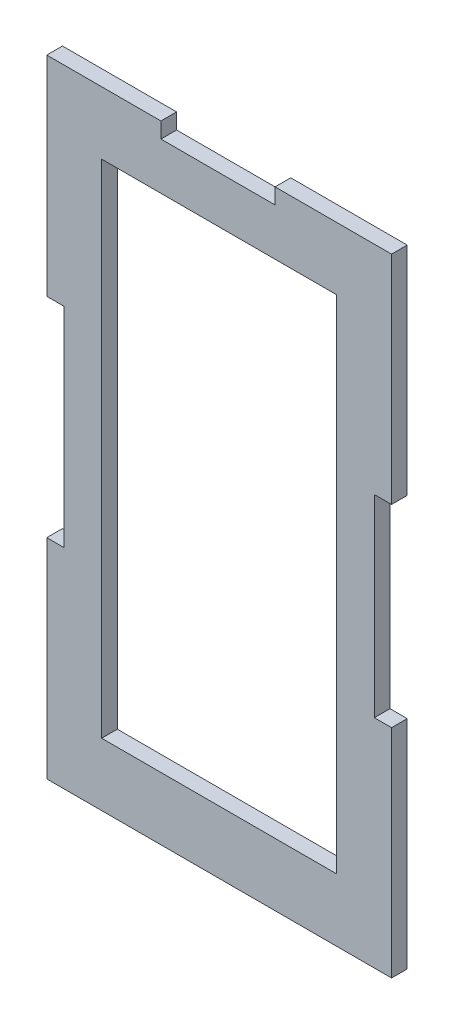
ISO-10303-21;
HEADER;
FILE_DESCRIPTION(('STEP AP214'),'2;1');
FILE_NAME('part.step','',(''),(''),'','','');
FILE_SCHEMA(('AUTOMOTIVE_DESIGN { 1 0 10303 214 1 1 1 1 }'));
ENDSEC;
DATA;
#1=APPLICATION_CONTEXT('core data for automotive mechanical design processes');
#2=APPLICATION_PROTOCOL_DEFINITION('international standard','automotive_design',2000,#1);
#3=PRODUCT_CONTEXT('',#1,'mechanical');
#4=PRODUCT('Part','Part','',(#3));
#5=PRODUCT_RELATED_PRODUCT_CATEGORY('part','',(#4));
#6=PRODUCT_DEFINITION_FORMATION('','',#4);
#7=PRODUCT_DEFINITION_CONTEXT('part definition',#1,'design');
#8=PRODUCT_DEFINITION('design','',#6,#7);
#9=PRODUCT_DEFINITION_SHAPE('','',#8);
#10=(LENGTH_UNIT() NAMED_UNIT(*) SI_UNIT(.MILLI.,.METRE.));
#11=(NAMED_UNIT(*) PLANE_ANGLE_UNIT() SI_UNIT($,.RADIAN.));
#12=(NAMED_UNIT(*) SI_UNIT($,.STERADIAN.) SOLID_ANGLE_UNIT());
#13=UNCERTAINTY_MEASURE_WITH_UNIT(LENGTH_MEASURE(1.E-05),#10,'distance_accuracy_value','');
#14=(GEOMETRIC_REPRESENTATION_CONTEXT(3) GLOBAL_UNCERTAINTY_ASSIGNED_CONTEXT((#13)) GLOBAL_UNIT_ASSIGNED_CONTEXT((#10,
#11,#12)) REPRESENTATION_CONTEXT('',''));
#15=CARTESIAN_POINT('',(0.,0.,0.));
#16=DIRECTION('',(0.,0.,1.));
#17=DIRECTION('',(1.,0.,0.));
#18=AXIS2_PLACEMENT_3D('',#15,#16,#17);
#19=CARTESIAN_POINT('',(27.94,50.8,2.54));
#20=DIRECTION('',(0.,-1.,0.));
#21=DIRECTION('',(1.,0.,0.));
#22=AXIS2_PLACEMENT_3D('',#19,#20,#21);
#23=PLANE('',#22);
#24=DIRECTION('',(0.,0.,-1.));
#25=VECTOR('',#24,1.);
#26=CARTESIAN_POINT('',(9.05921064516924,50.8,40.6399999999975));
#27=LINE('',#26,#25);
#28=CARTESIAN_POINT('',(9.05921064516924,50.8,2.54));
#29=VERTEX_POINT('',#28);
#30=CARTESIAN_POINT('',(9.05921064516924,50.8,-2.51187959321442E-12));
#31=VERTEX_POINT('',#30);
#32=EDGE_CURVE('E173',#29,#31,#27,.T.);
#33=ORIENTED_EDGE('',*,*,#32,.F.);
#34=DIRECTION('',(-1.,0.,0.));
#35=VECTOR('',#34,1.);
#36=CARTESIAN_POINT('',(27.94,50.8,2.54));
#37=LINE('',#36,#35);
#38=CARTESIAN_POINT('',(27.94,50.8,2.54));
#39=VERTEX_POINT('',#38);
#40=EDGE_CURVE('E50',#39,#29,#37,.T.);
#41=ORIENTED_EDGE('',*,*,#40,.F.);
#42=DIRECTION('',(0.,0.,-1.));
#43=VECTOR('',#42,1.);
#44=CARTESIAN_POINT('',(27.94,50.8,2.54));
#45=LINE('',#44,#43);
#46=CARTESIAN_POINT('',(27.94,50.8,0.));
#47=VERTEX_POINT('',#46);
#48=EDGE_CURVE('E197',#39,#47,#45,.T.);
#49=ORIENTED_EDGE('',*,*,#48,.T.);
#50=DIRECTION('',(-1.,0.,0.));
#51=VECTOR('',#50,1.);
#52=CARTESIAN_POINT('',(27.94,50.8,0.));
#53=LINE('',#52,#51);
#54=EDGE_CURVE('E190',#47,#31,#53,.T.);
#55=ORIENTED_EDGE('',*,*,#54,.T.);
#56=EDGE_LOOP('',(#33,#41,#49,#55));
#57=FACE_BOUND('',#56,.T.);
#58=ADVANCED_FACE('F35',(#57),#23,.F.);
#59=CARTESIAN_POINT('',(-27.94,50.8,2.54));
#60=DIRECTION('',(1.,0.,0.));
#61=DIRECTION('',(0.,1.,0.));
#62=AXIS2_PLACEMENT_3D('',#59,#60,#61);
#63=PLANE('',#62);
#64=DIRECTION('',(0.,0.,-1.));
#65=VECTOR('',#64,1.);
#66=CARTESIAN_POINT('',(-27.94,-16.9333333333333,2.54));
#67=LINE('',#66,#65);
#68=CARTESIAN_POINT('',(-27.94,-16.9333333333333,2.54));
#69=VERTEX_POINT('',#68);
#70=CARTESIAN_POINT('',(-27.94,-16.9333333333333,0.));
#71=VERTEX_POINT('',#70);
#72=EDGE_CURVE('E271',#69,#71,#67,.T.);
#73=ORIENTED_EDGE('',*,*,#72,.T.);
#74=DIRECTION('',(0.,-1.,0.));
#75=VECTOR('',#74,1.);
#76=CARTESIAN_POINT('',(-27.94,50.8,0.));
#77=LINE('',#76,#75);
#78=CARTESIAN_POINT('',(-27.94,-50.8,0.));
#79=VERTEX_POINT('',#78);
#80=EDGE_CURVE('E234',#71,#79,#77,.T.);
#81=ORIENTED_EDGE('',*,*,#80,.T.);
#82=DIRECTION('',(0.,0.,-1.));
#83=VECTOR('',#82,1.);
#84=CARTESIAN_POINT('',(-27.94,-50.8,2.54));
#85=LINE('',#84,#83);
#86=CARTESIAN_POINT('',(-27.94,-50.8,2.54));
#87=VERTEX_POINT('',#86);
#88=EDGE_CURVE('E11',#87,#79,#85,.T.);
#89=ORIENTED_EDGE('',*,*,#88,.F.);
#90=DIRECTION('',(0.,-1.,0.));
#91=VECTOR('',#90,1.);
#92=CARTESIAN_POINT('',(-27.94,50.8,2.54));
#93=LINE('',#92,#91);
#94=EDGE_CURVE('E198',#69,#87,#93,.T.);
#95=ORIENTED_EDGE('',*,*,#94,.F.);
#96=EDGE_LOOP('',(#73,#81,#89,#95));
#97=FACE_BOUND('',#96,.T.);
#98=ADVANCED_FACE('F364',(#97),#63,.F.);
#99=CARTESIAN_POINT('',(27.94,50.8,2.54));
#100=DIRECTION('',(-1.,0.,0.));
#101=DIRECTION('',(0.,-1.,0.));
#102=AXIS2_PLACEMENT_3D('',#99,#100,#101);
#103=PLANE('',#102);
#104=DIRECTION('',(0.,0.,-1.));
#105=VECTOR('',#104,1.);
#106=CARTESIAN_POINT('',(27.94,15.6633333333333,2.54));
#107=LINE('',#106,#105);
#108=CARTESIAN_POINT('',(27.94,15.6633333333333,2.54));
#109=VERTEX_POINT('',#108);
#110=CARTESIAN_POINT('',(27.94,15.6633333333333,0.));
#111=VERTEX_POINT('',#110);
#112=EDGE_CURVE('E243',#109,#111,#107,.T.);
#113=ORIENTED_EDGE('',*,*,#112,.T.);
#114=DIRECTION('',(0.,1.,0.));
#115=VECTOR('',#114,1.);
#116=CARTESIAN_POINT('',(27.94,50.8,0.));
#117=LINE('',#116,#115);
#118=EDGE_CURVE('E229',#111,#47,#117,.T.);
#119=ORIENTED_EDGE('',*,*,#118,.T.);
#120=ORIENTED_EDGE('',*,*,#48,.F.);
#121=DIRECTION('',(0.,1.,0.));
#122=VECTOR('',#121,1.);
#123=CARTESIAN_POINT('',(27.94,50.8,2.54));
#124=LINE('',#123,#122);
#125=EDGE_CURVE('E240',#109,#39,#124,.T.);
#126=ORIENTED_EDGE('',*,*,#125,.F.);
#127=EDGE_LOOP('',(#113,#119,#120,#126));
#128=FACE_BOUND('',#127,.T.);
#129=ADVANCED_FACE('F377',(#128),#103,.F.);
#130=CARTESIAN_POINT('',(0.,0.,2.54));
#131=DIRECTION('',(0.,0.,-1.));
#132=DIRECTION('',(-1.,0.,0.));
#133=AXIS2_PLACEMENT_3D('',#130,#131,#132);
#134=PLANE('',#133);
#135=ORIENTED_EDGE('',*,*,#40,.T.);
#136=DIRECTION('',(0.,-1.,0.));
#137=VECTOR('',#136,1.);
#138=CARTESIAN_POINT('',(9.05921064516924,50.8,2.53999999999748));
#139=LINE('',#138,#137);
#140=CARTESIAN_POINT('',(9.05921064516924,48.26,2.53999999999748));
#141=VERTEX_POINT('',#140);
#142=EDGE_CURVE('E179',#29,#141,#139,.T.);
#143=ORIENTED_EDGE('',*,*,#142,.T.);
#144=DIRECTION('',(-1.,0.,0.));
#145=VECTOR('',#144,1.);
#146=CARTESIAN_POINT('',(0.,48.26,2.54));
#147=LINE('',#146,#145);
#148=CARTESIAN_POINT('',(-9.44039467741537,48.26,2.53999999999748));
#149=VERTEX_POINT('',#148);
#150=EDGE_CURVE('E311',#141,#149,#147,.T.);
#151=ORIENTED_EDGE('',*,*,#150,.T.);
#152=DIRECTION('',(0.,-1.,0.));
#153=VECTOR('',#152,1.);
#154=CARTESIAN_POINT('',(-9.44039467741537,50.8,2.53999999999748));
#155=LINE('',#154,#153);
#156=CARTESIAN_POINT('',(-9.44039467741537,50.8,2.53999999999748));
#157=VERTEX_POINT('',#156);
#158=EDGE_CURVE('E326',#157,#149,#155,.T.);
#159=ORIENTED_EDGE('',*,*,#158,.F.);
#160=CARTESIAN_POINT('',(-27.94,50.8,2.54));
#161=VERTEX_POINT('',#160);
#162=EDGE_CURVE('E238',#157,#161,#37,.T.);
#163=ORIENTED_EDGE('',*,*,#162,.T.);
#164=CARTESIAN_POINT('',(-27.94,16.9333333333333,2.54));
#165=VERTEX_POINT('',#164);
#166=EDGE_CURVE('E201',#161,#165,#93,.T.);
#167=ORIENTED_EDGE('',*,*,#166,.T.);
#168=DIRECTION('',(1.,0.,0.));
#169=VECTOR('',#168,1.);
#170=CARTESIAN_POINT('',(0.,16.9333333333333,2.54));
#171=LINE('',#170,#169);
#172=CARTESIAN_POINT('',(-25.146,16.9333333333333,2.54));
#173=VERTEX_POINT('',#172);
#174=EDGE_CURVE('E278',#165,#173,#171,.T.);
#175=ORIENTED_EDGE('',*,*,#174,.T.);
#176=DIRECTION('',(0.,-1.,0.));
#177=VECTOR('',#176,1.);
#178=CARTESIAN_POINT('',(-25.146,0.,2.54));
#179=LINE('',#178,#177);
#180=CARTESIAN_POINT('',(-25.146,-16.9333333333333,2.54));
#181=VERTEX_POINT('',#180);
#182=EDGE_CURVE('E287',#173,#181,#179,.T.);
#183=ORIENTED_EDGE('',*,*,#182,.T.);
#184=DIRECTION('',(1.,0.,0.));
#185=VECTOR('',#184,1.);
#186=CARTESIAN_POINT('',(0.,-16.9333333333334,2.54));
#187=LINE('',#186,#185);
#188=EDGE_CURVE('E269',#69,#181,#187,.T.);
#189=ORIENTED_EDGE('',*,*,#188,.F.);
#190=ORIENTED_EDGE('',*,*,#94,.T.);
#191=DIRECTION('',(1.,0.,0.));
#192=VECTOR('',#191,1.);
#193=CARTESIAN_POINT('',(27.94,-50.8,2.54));
#194=LINE('',#193,#192);
#195=CARTESIAN_POINT('',(27.94,-50.8,2.54));
#196=VERTEX_POINT('',#195);
#197=EDGE_CURVE('E241',#87,#196,#194,.T.);
#198=ORIENTED_EDGE('',*,*,#197,.T.);
#199=CARTESIAN_POINT('',(27.94,-15.6633333333333,2.54));
#200=VERTEX_POINT('',#199);
#201=EDGE_CURVE('E219',#196,#200,#124,.T.);
#202=ORIENTED_EDGE('',*,*,#201,.T.);
#203=DIRECTION('',(-1.,0.,0.));
#204=VECTOR('',#203,1.);
#205=CARTESIAN_POINT('',(0.,-15.6633333333333,2.54));
#206=LINE('',#205,#204);
#207=CARTESIAN_POINT('',(25.146,-15.6633333333333,2.54));
#208=VERTEX_POINT('',#207);
#209=EDGE_CURVE('E262',#200,#208,#206,.T.);
#210=ORIENTED_EDGE('',*,*,#209,.T.);
#211=DIRECTION('',(0.,-1.,0.));
#212=VECTOR('',#211,1.);
#213=CARTESIAN_POINT('',(25.146,0.,2.54));
#214=LINE('',#213,#212);
#215=CARTESIAN_POINT('',(25.146,15.6633333333333,2.54));
#216=VERTEX_POINT('',#215);
#217=EDGE_CURVE('E246',#216,#208,#214,.T.);
#218=ORIENTED_EDGE('',*,*,#217,.F.);
#219=DIRECTION('',(-1.,0.,0.));
#220=VECTOR('',#219,1.);
#221=CARTESIAN_POINT('',(0.,15.6633333333333,2.54));
#222=LINE('',#221,#220);
#223=EDGE_CURVE('E255',#109,#216,#222,.T.);
#224=ORIENTED_EDGE('',*,*,#223,.F.);
#225=ORIENTED_EDGE('',*,*,#125,.T.);
#226=EDGE_LOOP('',(#135,#143,#151,#159,#163,#167,#175,#183,#189,#190,#198,#202,#210,#218,#224,#225));
#227=FACE_BOUND('',#226,.T.);
#228=DIRECTION('',(1.,0.,0.));
#229=VECTOR('',#228,1.);
#230=CARTESIAN_POINT('',(19.05,-40.64,2.54));
#231=LINE('',#230,#229);
#232=CARTESIAN_POINT('',(-19.05,-40.64,2.54));
#233=VERTEX_POINT('',#232);
#234=CARTESIAN_POINT('',(19.05,-40.64,2.54));
#235=VERTEX_POINT('',#234);
#236=EDGE_CURVE('E307',#233,#235,#231,.T.);
#237=ORIENTED_EDGE('',*,*,#236,.F.);
#238=DIRECTION('',(0.,-1.,0.));
#239=VECTOR('',#238,1.);
#240=CARTESIAN_POINT('',(-19.05,40.64,2.54));
#241=LINE('',#240,#239);
#242=CARTESIAN_POINT('',(-19.05,40.64,2.54));
#243=VERTEX_POINT('',#242);
#244=EDGE_CURVE('E58',#243,#233,#241,.T.);
#245=ORIENTED_EDGE('',*,*,#244,.F.);
#246=DIRECTION('',(-1.,0.,0.));
#247=VECTOR('',#246,1.);
#248=CARTESIAN_POINT('',(19.05,40.64,2.54));
#249=LINE('',#248,#247);
#250=CARTESIAN_POINT('',(19.05,40.64,2.54));
#251=VERTEX_POINT('',#250);
#252=EDGE_CURVE('E300',#251,#243,#249,.T.);
#253=ORIENTED_EDGE('',*,*,#252,.F.);
#254=DIRECTION('',(0.,1.,0.));
#255=VECTOR('',#254,1.);
#256=CARTESIAN_POINT('',(19.05,40.64,2.54));
#257=LINE('',#256,#255);
#258=EDGE_CURVE('E304',#235,#251,#257,.T.);
#259=ORIENTED_EDGE('',*,*,#258,.F.);
#260=EDGE_LOOP('',(#237,#245,#253,#259));
#261=FACE_BOUND('',#260,.T.);
#262=ADVANCED_FACE('F337',(#227,#261),#134,.F.);
#263=CARTESIAN_POINT('',(0.,0.,0.));
#264=DIRECTION('',(0.,0.,-1.));
#265=DIRECTION('',(-1.,0.,0.));
#266=AXIS2_PLACEMENT_3D('',#263,#264,#265);
#267=PLANE('',#266);
#268=DIRECTION('',(0.,-1.,0.));
#269=VECTOR('',#268,1.);
#270=CARTESIAN_POINT('',(-9.44039467741537,50.8,-2.51187959321442E-12));
#271=LINE('',#270,#269);
#272=CARTESIAN_POINT('',(-9.44039467741537,50.8,-2.51187959321442E-12));
#273=VERTEX_POINT('',#272);
#274=CARTESIAN_POINT('',(-9.44039467741537,48.26,-2.51187959321442E-12));
#275=VERTEX_POINT('',#274);
#276=EDGE_CURVE('E325',#273,#275,#271,.T.);
#277=ORIENTED_EDGE('',*,*,#276,.T.);
#278=DIRECTION('',(1.,0.,0.));
#279=VECTOR('',#278,1.);
#280=CARTESIAN_POINT('',(27.686,48.26,-2.51187959321442E-12));
#281=LINE('',#280,#279);
#282=CARTESIAN_POINT('',(9.05921064516924,48.26,-2.51187959321442E-12));
#283=VERTEX_POINT('',#282);
#284=EDGE_CURVE('E192',#275,#283,#281,.T.);
#285=ORIENTED_EDGE('',*,*,#284,.T.);
#286=DIRECTION('',(0.,-1.,0.));
#287=VECTOR('',#286,1.);
#288=CARTESIAN_POINT('',(9.05921064516924,50.8,-2.51187959321442E-12));
#289=LINE('',#288,#287);
#290=EDGE_CURVE('E177',#31,#283,#289,.T.);
#291=ORIENTED_EDGE('',*,*,#290,.F.);
#292=ORIENTED_EDGE('',*,*,#54,.F.);
#293=ORIENTED_EDGE('',*,*,#118,.F.);
#294=DIRECTION('',(-1.,0.,0.));
#295=VECTOR('',#294,1.);
#296=CARTESIAN_POINT('',(0.,15.6633333333333,0.));
#297=LINE('',#296,#295);
#298=CARTESIAN_POINT('',(25.146,15.6633333333333,0.));
#299=VERTEX_POINT('',#298);
#300=EDGE_CURVE('E257',#111,#299,#297,.T.);
#301=ORIENTED_EDGE('',*,*,#300,.T.);
#302=DIRECTION('',(0.,-1.,0.));
#303=VECTOR('',#302,1.);
#304=CARTESIAN_POINT('',(25.146,0.,0.));
#305=LINE('',#304,#303);
#306=CARTESIAN_POINT('',(25.146,-15.6633333333333,0.));
#307=VERTEX_POINT('',#306);
#308=EDGE_CURVE('E253',#299,#307,#305,.T.);
#309=ORIENTED_EDGE('',*,*,#308,.T.);
#310=DIRECTION('',(-1.,0.,0.));
#311=VECTOR('',#310,1.);
#312=CARTESIAN_POINT('',(0.,-15.6633333333333,0.));
#313=LINE('',#312,#311);
#314=CARTESIAN_POINT('',(27.94,-15.6633333333333,0.));
#315=VERTEX_POINT('',#314);
#316=EDGE_CURVE('E228',#315,#307,#313,.T.);
#317=ORIENTED_EDGE('',*,*,#316,.F.);
#318=CARTESIAN_POINT('',(27.94,-50.8,0.));
#319=VERTEX_POINT('',#318);
#320=EDGE_CURVE('E203',#319,#315,#117,.T.);
#321=ORIENTED_EDGE('',*,*,#320,.F.);
#322=DIRECTION('',(1.,0.,0.));
#323=VECTOR('',#322,1.);
#324=CARTESIAN_POINT('',(27.94,-50.8,0.));
#325=LINE('',#324,#323);
#326=EDGE_CURVE('E225',#79,#319,#325,.T.);
#327=ORIENTED_EDGE('',*,*,#326,.F.);
#328=ORIENTED_EDGE('',*,*,#80,.F.);
#329=DIRECTION('',(1.,0.,0.));
#330=VECTOR('',#329,1.);
#331=CARTESIAN_POINT('',(0.,-16.9333333333334,0.));
#332=LINE('',#331,#330);
#333=CARTESIAN_POINT('',(-25.146,-16.9333333333333,0.));
#334=VERTEX_POINT('',#333);
#335=EDGE_CURVE('E275',#71,#334,#332,.T.);
#336=ORIENTED_EDGE('',*,*,#335,.T.);
#337=DIRECTION('',(0.,-1.,0.));
#338=VECTOR('',#337,1.);
#339=CARTESIAN_POINT('',(-25.146,0.,0.));
#340=LINE('',#339,#338);
#341=CARTESIAN_POINT('',(-25.146,16.9333333333333,0.));
#342=VERTEX_POINT('',#341);
#343=EDGE_CURVE('E279',#342,#334,#340,.T.);
#344=ORIENTED_EDGE('',*,*,#343,.F.);
#345=DIRECTION('',(1.,0.,0.));
#346=VECTOR('',#345,1.);
#347=CARTESIAN_POINT('',(0.,16.9333333333333,0.));
#348=LINE('',#347,#346);
#349=CARTESIAN_POINT('',(-27.94,16.9333333333333,0.));
#350=VERTEX_POINT('',#349);
#351=EDGE_CURVE('E282',#350,#342,#348,.T.);
#352=ORIENTED_EDGE('',*,*,#351,.F.);
#353=CARTESIAN_POINT('',(-27.94,50.8,0.));
#354=VERTEX_POINT('',#353);
#355=EDGE_CURVE('E232',#354,#350,#77,.T.);
#356=ORIENTED_EDGE('',*,*,#355,.F.);
#357=EDGE_CURVE('E199',#273,#354,#53,.T.);
#358=ORIENTED_EDGE('',*,*,#357,.F.);
#359=EDGE_LOOP('',(#277,#285,#291,#292,#293,#301,#309,#317,#321,#327,#328,#336,#344,#352,#356,#358));
#360=FACE_BOUND('',#359,.T.);
#361=DIRECTION('',(0.,-1.,0.));
#362=VECTOR('',#361,1.);
#363=CARTESIAN_POINT('',(-19.05,40.64,0.));
#364=LINE('',#363,#362);
#365=CARTESIAN_POINT('',(-19.05,40.64,0.));
#366=VERTEX_POINT('',#365);
#367=CARTESIAN_POINT('',(-19.05,-40.64,0.));
#368=VERTEX_POINT('',#367);
#369=EDGE_CURVE('E303',#366,#368,#364,.T.);
#370=ORIENTED_EDGE('',*,*,#369,.T.);
#371=DIRECTION('',(1.,0.,0.));
#372=VECTOR('',#371,1.);
#373=CARTESIAN_POINT('',(19.05,-40.64,0.));
#374=LINE('',#373,#372);
#375=CARTESIAN_POINT('',(19.05,-40.64,0.));
#376=VERTEX_POINT('',#375);
#377=EDGE_CURVE('E317',#368,#376,#374,.T.);
#378=ORIENTED_EDGE('',*,*,#377,.T.);
#379=DIRECTION('',(0.,1.,0.));
#380=VECTOR('',#379,1.);
#381=CARTESIAN_POINT('',(19.05,40.64,0.));
#382=LINE('',#381,#380);
#383=CARTESIAN_POINT('',(19.05,40.64,0.));
#384=VERTEX_POINT('',#383);
#385=EDGE_CURVE('E314',#376,#384,#382,.T.);
#386=ORIENTED_EDGE('',*,*,#385,.T.);
#387=DIRECTION('',(-1.,0.,0.));
#388=VECTOR('',#387,1.);
#389=CARTESIAN_POINT('',(19.05,40.64,0.));
#390=LINE('',#389,#388);
#391=EDGE_CURVE('E295',#384,#366,#390,.T.);
#392=ORIENTED_EDGE('',*,*,#391,.T.);
#393=EDGE_LOOP('',(#370,#378,#386,#392));
#394=FACE_BOUND('',#393,.T.);
#395=ADVANCED_FACE('F187',(#360,#394),#267,.T.);
#396=ORIENTED_EDGE('',*,*,#355,.T.);
#397=DIRECTION('',(0.,0.,-1.));
#398=VECTOR('',#397,1.);
#399=CARTESIAN_POINT('',(-27.94,16.9333333333333,2.54));
#400=LINE('',#399,#398);
#401=EDGE_CURVE('E260',#165,#350,#400,.T.);
#402=ORIENTED_EDGE('',*,*,#401,.F.);
#403=ORIENTED_EDGE('',*,*,#166,.F.);
#404=DIRECTION('',(0.,0.,-1.));
#405=VECTOR('',#404,1.);
#406=CARTESIAN_POINT('',(-27.94,50.8,2.54));
#407=LINE('',#406,#405);
#408=EDGE_CURVE('E207',#161,#354,#407,.T.);
#409=ORIENTED_EDGE('',*,*,#408,.T.);
#410=EDGE_LOOP('',(#396,#402,#403,#409));
#411=FACE_BOUND('',#410,.T.);
#412=ADVANCED_FACE('F37',(#411),#63,.F.);
#413=CARTESIAN_POINT('',(27.94,-50.8,2.54));
#414=DIRECTION('',(0.,1.,0.));
#415=DIRECTION('',(-1.,0.,0.));
#416=AXIS2_PLACEMENT_3D('',#413,#414,#415);
#417=PLANE('',#416);
#418=ORIENTED_EDGE('',*,*,#326,.T.);
#419=DIRECTION('',(0.,0.,-1.));
#420=VECTOR('',#419,1.);
#421=CARTESIAN_POINT('',(27.94,-50.8,2.54));
#422=LINE('',#421,#420);
#423=EDGE_CURVE('E43',#196,#319,#422,.T.);
#424=ORIENTED_EDGE('',*,*,#423,.F.);
#425=ORIENTED_EDGE('',*,*,#197,.F.);
#426=ORIENTED_EDGE('',*,*,#88,.T.);
#427=EDGE_LOOP('',(#418,#424,#425,#426));
#428=FACE_BOUND('',#427,.T.);
#429=ADVANCED_FACE('F365',(#428),#417,.F.);
#430=ORIENTED_EDGE('',*,*,#320,.T.);
#431=DIRECTION('',(0.,0.,-1.));
#432=VECTOR('',#431,1.);
#433=CARTESIAN_POINT('',(27.94,-15.6633333333333,2.54));
#434=LINE('',#433,#432);
#435=EDGE_CURVE('E245',#200,#315,#434,.T.);
#436=ORIENTED_EDGE('',*,*,#435,.F.);
#437=ORIENTED_EDGE('',*,*,#201,.F.);
#438=ORIENTED_EDGE('',*,*,#423,.T.);
#439=EDGE_LOOP('',(#430,#436,#437,#438));
#440=FACE_BOUND('',#439,.T.);
#441=ADVANCED_FACE('F216',(#440),#103,.F.);
#442=ORIENTED_EDGE('',*,*,#162,.F.);
#443=DIRECTION('',(0.,0.,-1.));
#444=VECTOR('',#443,1.);
#445=CARTESIAN_POINT('',(-9.44039467741537,50.8,40.6399999999975));
#446=LINE('',#445,#444);
#447=EDGE_CURVE('E328',#157,#273,#446,.T.);
#448=ORIENTED_EDGE('',*,*,#447,.T.);
#449=ORIENTED_EDGE('',*,*,#357,.T.);
#450=ORIENTED_EDGE('',*,*,#408,.F.);
#451=EDGE_LOOP('',(#442,#448,#449,#450));
#452=FACE_BOUND('',#451,.T.);
#453=ADVANCED_FACE('F344',(#452),#23,.F.);
#454=CARTESIAN_POINT('',(0.,15.6633333333333,2.54));
#455=DIRECTION('',(0.,-1.,0.));
#456=DIRECTION('',(0.,0.,-1.));
#457=AXIS2_PLACEMENT_3D('',#454,#455,#456);
#458=PLANE('',#457);
#459=ORIENTED_EDGE('',*,*,#300,.F.);
#460=ORIENTED_EDGE('',*,*,#112,.F.);
#461=ORIENTED_EDGE('',*,*,#223,.T.);
#462=DIRECTION('',(0.,0.,-1.));
#463=VECTOR('',#462,1.);
#464=CARTESIAN_POINT('',(25.146,15.6633333333333,2.54));
#465=LINE('',#464,#463);
#466=EDGE_CURVE('E250',#216,#299,#465,.T.);
#467=ORIENTED_EDGE('',*,*,#466,.T.);
#468=EDGE_LOOP('',(#459,#460,#461,#467));
#469=FACE_BOUND('',#468,.T.);
#470=ADVANCED_FACE('F375',(#469),#458,.T.);
#471=CARTESIAN_POINT('',(25.146,0.,2.54));
#472=DIRECTION('',(1.,0.,0.));
#473=DIRECTION('',(0.,1.,0.));
#474=AXIS2_PLACEMENT_3D('',#471,#472,#473);
#475=PLANE('',#474);
#476=ORIENTED_EDGE('',*,*,#308,.F.);
#477=ORIENTED_EDGE('',*,*,#466,.F.);
#478=ORIENTED_EDGE('',*,*,#217,.T.);
#479=DIRECTION('',(0.,0.,-1.));
#480=VECTOR('',#479,1.);
#481=CARTESIAN_POINT('',(25.146,-15.6633333333333,2.54));
#482=LINE('',#481,#480);
#483=EDGE_CURVE('E248',#208,#307,#482,.T.);
#484=ORIENTED_EDGE('',*,*,#483,.T.);
#485=EDGE_LOOP('',(#476,#477,#478,#484));
#486=FACE_BOUND('',#485,.T.);
#487=ADVANCED_FACE('F372',(#486),#475,.T.);
#488=CARTESIAN_POINT('',(0.,-15.6633333333333,2.54));
#489=DIRECTION('',(0.,-1.,0.));
#490=DIRECTION('',(0.,0.,-1.));
#491=AXIS2_PLACEMENT_3D('',#488,#489,#490);
#492=PLANE('',#491);
#493=ORIENTED_EDGE('',*,*,#316,.T.);
#494=ORIENTED_EDGE('',*,*,#483,.F.);
#495=ORIENTED_EDGE('',*,*,#209,.F.);
#496=ORIENTED_EDGE('',*,*,#435,.T.);
#497=EDGE_LOOP('',(#493,#494,#495,#496));
#498=FACE_BOUND('',#497,.T.);
#499=ADVANCED_FACE('F370',(#498),#492,.F.);
#500=CARTESIAN_POINT('',(0.,16.9333333333333,2.54));
#501=DIRECTION('',(0.,1.,0.));
#502=DIRECTION('',(0.,0.,1.));
#503=AXIS2_PLACEMENT_3D('',#500,#501,#502);
#504=PLANE('',#503);
#505=ORIENTED_EDGE('',*,*,#351,.T.);
#506=DIRECTION('',(0.,0.,-1.));
#507=VECTOR('',#506,1.);
#508=CARTESIAN_POINT('',(-25.146,16.9333333333333,2.54));
#509=LINE('',#508,#507);
#510=EDGE_CURVE('E266',#173,#342,#509,.T.);
#511=ORIENTED_EDGE('',*,*,#510,.F.);
#512=ORIENTED_EDGE('',*,*,#174,.F.);
#513=ORIENTED_EDGE('',*,*,#401,.T.);
#514=EDGE_LOOP('',(#505,#511,#512,#513));
#515=FACE_BOUND('',#514,.T.);
#516=ADVANCED_FACE('F352',(#515),#504,.F.);
#517=CARTESIAN_POINT('',(0.,-16.9333333333334,2.54));
#518=DIRECTION('',(0.,1.,0.));
#519=DIRECTION('',(-1.,0.,0.));
#520=AXIS2_PLACEMENT_3D('',#517,#518,#519);
#521=PLANE('',#520);
#522=ORIENTED_EDGE('',*,*,#335,.F.);
#523=ORIENTED_EDGE('',*,*,#72,.F.);
#524=ORIENTED_EDGE('',*,*,#188,.T.);
#525=DIRECTION('',(0.,0.,-1.));
#526=VECTOR('',#525,1.);
#527=CARTESIAN_POINT('',(-25.146,-16.9333333333333,2.54));
#528=LINE('',#527,#526);
#529=EDGE_CURVE('E268',#181,#334,#528,.T.);
#530=ORIENTED_EDGE('',*,*,#529,.T.);
#531=EDGE_LOOP('',(#522,#523,#524,#530));
#532=FACE_BOUND('',#531,.T.);
#533=ADVANCED_FACE('F465',(#532),#521,.T.);
#534=CARTESIAN_POINT('',(-25.146,0.,2.54));
#535=DIRECTION('',(1.,0.,0.));
#536=DIRECTION('',(0.,1.,0.));
#537=AXIS2_PLACEMENT_3D('',#534,#535,#536);
#538=PLANE('',#537);
#539=ORIENTED_EDGE('',*,*,#343,.T.);
#540=ORIENTED_EDGE('',*,*,#529,.F.);
#541=ORIENTED_EDGE('',*,*,#182,.F.);
#542=ORIENTED_EDGE('',*,*,#510,.T.);
#543=EDGE_LOOP('',(#539,#540,#541,#542));
#544=FACE_BOUND('',#543,.T.);
#545=ADVANCED_FACE('F358',(#544),#538,.F.);
#546=CARTESIAN_POINT('',(-19.05,40.64,0.));
#547=DIRECTION('',(-1.,0.,0.));
#548=DIRECTION('',(0.,-1.,0.));
#549=AXIS2_PLACEMENT_3D('',#546,#547,#548);
#550=PLANE('',#549);
#551=ORIENTED_EDGE('',*,*,#244,.T.);
#552=DIRECTION('',(0.,0.,1.));
#553=VECTOR('',#552,1.);
#554=CARTESIAN_POINT('',(-19.05,-40.64,0.));
#555=LINE('',#554,#553);
#556=EDGE_CURVE('E292',#368,#233,#555,.T.);
#557=ORIENTED_EDGE('',*,*,#556,.F.);
#558=ORIENTED_EDGE('',*,*,#369,.F.);
#559=DIRECTION('',(0.,0.,1.));
#560=VECTOR('',#559,1.);
#561=CARTESIAN_POINT('',(-19.05,40.64,0.));
#562=LINE('',#561,#560);
#563=EDGE_CURVE('E285',#366,#243,#562,.T.);
#564=ORIENTED_EDGE('',*,*,#563,.T.);
#565=EDGE_LOOP('',(#551,#557,#558,#564));
#566=FACE_BOUND('',#565,.T.);
#567=ADVANCED_FACE('F480',(#566),#550,.F.);
#568=CARTESIAN_POINT('',(19.05,40.64,0.));
#569=DIRECTION('',(0.,1.,0.));
#570=DIRECTION('',(0.,0.,1.));
#571=AXIS2_PLACEMENT_3D('',#568,#569,#570);
#572=PLANE('',#571);
#573=ORIENTED_EDGE('',*,*,#252,.T.);
#574=ORIENTED_EDGE('',*,*,#563,.F.);
#575=ORIENTED_EDGE('',*,*,#391,.F.);
#576=DIRECTION('',(0.,0.,1.));
#577=VECTOR('',#576,1.);
#578=CARTESIAN_POINT('',(19.05,40.64,0.));
#579=LINE('',#578,#577);
#580=EDGE_CURVE('E297',#384,#251,#579,.T.);
#581=ORIENTED_EDGE('',*,*,#580,.T.);
#582=EDGE_LOOP('',(#573,#574,#575,#581));
#583=FACE_BOUND('',#582,.T.);
#584=ADVANCED_FACE('F488',(#583),#572,.F.);
#585=CARTESIAN_POINT('',(19.05,40.64,0.));
#586=DIRECTION('',(1.,0.,0.));
#587=DIRECTION('',(0.,1.,0.));
#588=AXIS2_PLACEMENT_3D('',#585,#586,#587);
#589=PLANE('',#588);
#590=ORIENTED_EDGE('',*,*,#258,.T.);
#591=ORIENTED_EDGE('',*,*,#580,.F.);
#592=ORIENTED_EDGE('',*,*,#385,.F.);
#593=DIRECTION('',(0.,0.,1.));
#594=VECTOR('',#593,1.);
#595=CARTESIAN_POINT('',(19.05,-40.64,0.));
#596=LINE('',#595,#594);
#597=EDGE_CURVE('E294',#376,#235,#596,.T.);
#598=ORIENTED_EDGE('',*,*,#597,.T.);
#599=EDGE_LOOP('',(#590,#591,#592,#598));
#600=FACE_BOUND('',#599,.T.);
#601=ADVANCED_FACE('F496',(#600),#589,.F.);
#602=CARTESIAN_POINT('',(19.05,-40.64,0.));
#603=DIRECTION('',(0.,-1.,0.));
#604=DIRECTION('',(0.,0.,-1.));
#605=AXIS2_PLACEMENT_3D('',#602,#603,#604);
#606=PLANE('',#605);
#607=ORIENTED_EDGE('',*,*,#236,.T.);
#608=ORIENTED_EDGE('',*,*,#597,.F.);
#609=ORIENTED_EDGE('',*,*,#377,.F.);
#610=ORIENTED_EDGE('',*,*,#556,.T.);
#611=EDGE_LOOP('',(#607,#608,#609,#610));
#612=FACE_BOUND('',#611,.T.);
#613=ADVANCED_FACE('F505',(#612),#606,.F.);
#614=CARTESIAN_POINT('',(-0.126999999999981,48.26,40.6399999999975));
#615=DIRECTION('',(0.,-1.,0.));
#616=DIRECTION('',(0.,0.,1.));
#617=AXIS2_PLACEMENT_3D('',#614,#615,#616);
#618=PLANE('',#617);
#619=DIRECTION('',(0.,0.,-1.));
#620=VECTOR('',#619,1.);
#621=CARTESIAN_POINT('',(9.05921064516924,48.26,40.6399999999975));
#622=LINE('',#621,#620);
#623=EDGE_CURVE('E182',#141,#283,#622,.T.);
#624=ORIENTED_EDGE('',*,*,#623,.T.);
#625=ORIENTED_EDGE('',*,*,#284,.F.);
#626=DIRECTION('',(0.,0.,-1.));
#627=VECTOR('',#626,1.);
#628=CARTESIAN_POINT('',(-9.44039467741537,48.26,40.6399999999975));
#629=LINE('',#628,#627);
#630=EDGE_CURVE('E193',#149,#275,#629,.T.);
#631=ORIENTED_EDGE('',*,*,#630,.F.);
#632=ORIENTED_EDGE('',*,*,#150,.F.);
#633=EDGE_LOOP('',(#624,#625,#631,#632));
#634=FACE_BOUND('',#633,.T.);
#635=ADVANCED_FACE('F335',(#634),#618,.F.);
#636=CARTESIAN_POINT('',(-9.44039467741537,50.8,40.6399999999975));
#637=DIRECTION('',(-1.,0.,0.));
#638=DIRECTION('',(0.,-1.,0.));
#639=AXIS2_PLACEMENT_3D('',#636,#637,#638);
#640=PLANE('',#639);
#641=ORIENTED_EDGE('',*,*,#630,.T.);
#642=ORIENTED_EDGE('',*,*,#276,.F.);
#643=ORIENTED_EDGE('',*,*,#447,.F.);
#644=ORIENTED_EDGE('',*,*,#158,.T.);
#645=EDGE_LOOP('',(#641,#642,#643,#644));
#646=FACE_BOUND('',#645,.T.);
#647=ADVANCED_FACE('F524',(#646),#640,.F.);
#648=CARTESIAN_POINT('',(9.05921064516924,50.8,40.6399999999975));
#649=DIRECTION('',(-1.,0.,0.));
#650=DIRECTION('',(0.,-1.,0.));
#651=AXIS2_PLACEMENT_3D('',#648,#649,#650);
#652=PLANE('',#651);
#653=ORIENTED_EDGE('',*,*,#623,.F.);
#654=ORIENTED_EDGE('',*,*,#142,.F.);
#655=ORIENTED_EDGE('',*,*,#32,.T.);
#656=ORIENTED_EDGE('',*,*,#290,.T.);
#657=EDGE_LOOP('',(#653,#654,#655,#656));
#658=FACE_BOUND('',#657,.T.);
#659=ADVANCED_FACE('F176',(#658),#652,.T.);
#660=CLOSED_SHELL('',(#58,#98,#129,#262,#395,#412,#429,#441,#453,#470,#487,#499,#516,#533,#545,
#567,#584,#601,#613,#635,#647,#659));
#661=MANIFOLD_SOLID_BREP('B2',#660);
#662=ADVANCED_BREP_SHAPE_REPRESENTATION('',(#18,#661),#14);
#663=SHAPE_DEFINITION_REPRESENTATION(#9,#662);
ENDSEC;
END-ISO-10303-21;
